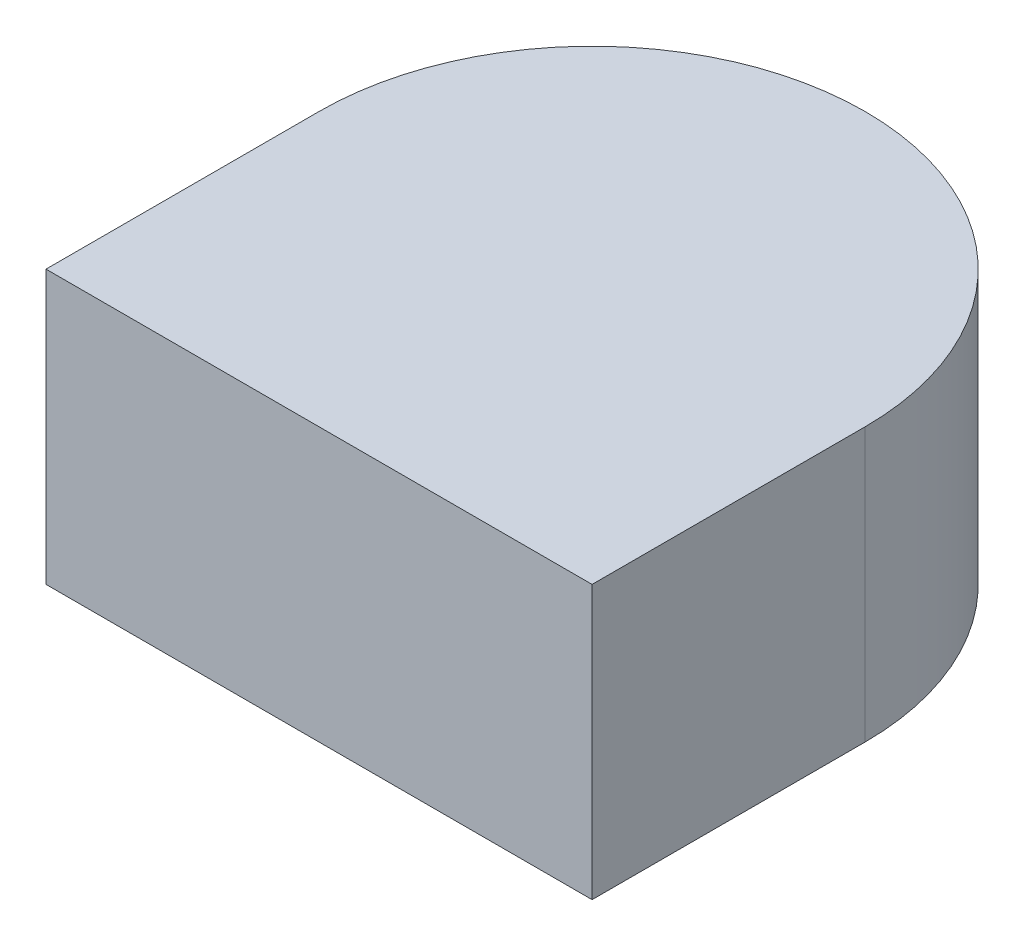
ISO-10303-21;
HEADER;
FILE_DESCRIPTION(('STEP AP214'),'2;1');
FILE_NAME('part.step','',(''),(''),'','','');
FILE_SCHEMA(('AUTOMOTIVE_DESIGN { 1 0 10303 214 1 1 1 1 }'));
ENDSEC;
DATA;
#1=APPLICATION_CONTEXT('core data for automotive mechanical design processes');
#2=APPLICATION_PROTOCOL_DEFINITION('international standard','automotive_design',2000,#1);
#3=PRODUCT_CONTEXT('',#1,'mechanical');
#4=PRODUCT('Part','Part','',(#3));
#5=PRODUCT_RELATED_PRODUCT_CATEGORY('part','',(#4));
#6=PRODUCT_DEFINITION_FORMATION('','',#4);
#7=PRODUCT_DEFINITION_CONTEXT('part definition',#1,'design');
#8=PRODUCT_DEFINITION('design','',#6,#7);
#9=PRODUCT_DEFINITION_SHAPE('','',#8);
#10=(LENGTH_UNIT() NAMED_UNIT(*) SI_UNIT(.MILLI.,.METRE.));
#11=(NAMED_UNIT(*) PLANE_ANGLE_UNIT() SI_UNIT($,.RADIAN.));
#12=(NAMED_UNIT(*) SI_UNIT($,.STERADIAN.) SOLID_ANGLE_UNIT());
#13=UNCERTAINTY_MEASURE_WITH_UNIT(LENGTH_MEASURE(1.E-05),#10,'distance_accuracy_value','');
#14=(GEOMETRIC_REPRESENTATION_CONTEXT(3) GLOBAL_UNCERTAINTY_ASSIGNED_CONTEXT((#13)) GLOBAL_UNIT_ASSIGNED_CONTEXT((#10,
#11,#12)) REPRESENTATION_CONTEXT('',''));
#15=CARTESIAN_POINT('',(0.,0.,0.));
#16=DIRECTION('',(0.,0.,1.));
#17=DIRECTION('',(1.,0.,0.));
#18=AXIS2_PLACEMENT_3D('',#15,#16,#17);
#19=CARTESIAN_POINT('',(-20.,20.,40.));
#20=DIRECTION('',(1.,0.,0.));
#21=DIRECTION('',(0.,0.,-1.));
#22=AXIS2_PLACEMENT_3D('',#19,#20,#21);
#23=PLANE('',#22);
#24=DIRECTION('',(0.,0.,1.));
#25=VECTOR('',#24,1.);
#26=CARTESIAN_POINT('',(-20.,0.,40.));
#27=LINE('',#26,#25);
#28=CARTESIAN_POINT('',(-20.,0.,20.));
#29=VERTEX_POINT('',#28);
#30=CARTESIAN_POINT('',(-20.,0.,40.));
#31=VERTEX_POINT('',#30);
#32=EDGE_CURVE('E100',#29,#31,#27,.T.);
#33=ORIENTED_EDGE('',*,*,#32,.T.);
#34=DIRECTION('',(0.,-1.,0.));
#35=VECTOR('',#34,1.);
#36=CARTESIAN_POINT('',(-20.,20.,40.));
#37=LINE('',#36,#35);
#38=CARTESIAN_POINT('',(-20.,20.,40.));
#39=VERTEX_POINT('',#38);
#40=EDGE_CURVE('E11',#39,#31,#37,.T.);
#41=ORIENTED_EDGE('',*,*,#40,.F.);
#42=DIRECTION('',(0.,0.,1.));
#43=VECTOR('',#42,1.);
#44=CARTESIAN_POINT('',(-20.,20.,40.));
#45=LINE('',#44,#43);
#46=CARTESIAN_POINT('',(-20.,20.,20.));
#47=VERTEX_POINT('',#46);
#48=EDGE_CURVE('E88',#47,#39,#45,.T.);
#49=ORIENTED_EDGE('',*,*,#48,.F.);
#50=DIRECTION('',(0.,-1.,0.));
#51=VECTOR('',#50,1.);
#52=CARTESIAN_POINT('',(-20.,20.,20.));
#53=LINE('',#52,#51);
#54=EDGE_CURVE('E96',#47,#29,#53,.T.);
#55=ORIENTED_EDGE('',*,*,#54,.T.);
#56=EDGE_LOOP('',(#33,#41,#49,#55));
#57=FACE_BOUND('',#56,.T.);
#58=ADVANCED_FACE('F37',(#57),#23,.F.);
#59=CARTESIAN_POINT('',(-20.,20.,40.));
#60=DIRECTION('',(0.,0.,-1.));
#61=DIRECTION('',(-1.,0.,0.));
#62=AXIS2_PLACEMENT_3D('',#59,#60,#61);
#63=PLANE('',#62);
#64=DIRECTION('',(1.,0.,0.));
#65=VECTOR('',#64,1.);
#66=CARTESIAN_POINT('',(-20.,0.,40.));
#67=LINE('',#66,#65);
#68=CARTESIAN_POINT('',(20.,0.,40.));
#69=VERTEX_POINT('',#68);
#70=EDGE_CURVE('E92',#31,#69,#67,.T.);
#71=ORIENTED_EDGE('',*,*,#70,.T.);
#72=DIRECTION('',(0.,-1.,0.));
#73=VECTOR('',#72,1.);
#74=CARTESIAN_POINT('',(20.,20.,40.));
#75=LINE('',#74,#73);
#76=CARTESIAN_POINT('',(20.,20.,40.));
#77=VERTEX_POINT('',#76);
#78=EDGE_CURVE('E45',#77,#69,#75,.T.);
#79=ORIENTED_EDGE('',*,*,#78,.F.);
#80=DIRECTION('',(1.,0.,0.));
#81=VECTOR('',#80,1.);
#82=CARTESIAN_POINT('',(-20.,20.,40.));
#83=LINE('',#82,#81);
#84=EDGE_CURVE('E83',#39,#77,#83,.T.);
#85=ORIENTED_EDGE('',*,*,#84,.F.);
#86=ORIENTED_EDGE('',*,*,#40,.T.);
#87=EDGE_LOOP('',(#71,#79,#85,#86));
#88=FACE_BOUND('',#87,.T.);
#89=ADVANCED_FACE('F91',(#88),#63,.F.);
#90=CARTESIAN_POINT('',(20.,20.,40.));
#91=DIRECTION('',(-1.,0.,0.));
#92=DIRECTION('',(0.,0.,1.));
#93=AXIS2_PLACEMENT_3D('',#90,#91,#92);
#94=PLANE('',#93);
#95=DIRECTION('',(0.,0.,-1.));
#96=VECTOR('',#95,1.);
#97=CARTESIAN_POINT('',(20.,0.,40.));
#98=LINE('',#97,#96);
#99=CARTESIAN_POINT('',(20.,0.,20.));
#100=VERTEX_POINT('',#99);
#101=EDGE_CURVE('E70',#69,#100,#98,.T.);
#102=ORIENTED_EDGE('',*,*,#101,.T.);
#103=DIRECTION('',(0.,-1.,0.));
#104=VECTOR('',#103,1.);
#105=CARTESIAN_POINT('',(20.,20.,20.));
#106=LINE('',#105,#104);
#107=CARTESIAN_POINT('',(20.,20.,20.));
#108=VERTEX_POINT('',#107);
#109=EDGE_CURVE('E93',#108,#100,#106,.T.);
#110=ORIENTED_EDGE('',*,*,#109,.F.);
#111=DIRECTION('',(0.,0.,-1.));
#112=VECTOR('',#111,1.);
#113=CARTESIAN_POINT('',(20.,20.,40.));
#114=LINE('',#113,#112);
#115=EDGE_CURVE('E86',#77,#108,#114,.T.);
#116=ORIENTED_EDGE('',*,*,#115,.F.);
#117=ORIENTED_EDGE('',*,*,#78,.T.);
#118=EDGE_LOOP('',(#102,#110,#116,#117));
#119=FACE_BOUND('',#118,.T.);
#120=ADVANCED_FACE('F94',(#119),#94,.F.);
#121=CARTESIAN_POINT('',(0.,20.,20.));
#122=DIRECTION('',(0.,-1.,0.));
#123=DIRECTION('',(0.,0.,-1.));
#124=AXIS2_PLACEMENT_3D('',#121,#122,#123);
#125=CYLINDRICAL_SURFACE('',#124,20.);
#126=CARTESIAN_POINT('',(0.,0.,20.));
#127=DIRECTION('',(0.,1.,0.));
#128=DIRECTION('',(0.,0.,-1.));
#129=AXIS2_PLACEMENT_3D('',#126,#127,#128);
#130=CIRCLE('',#129,20.);
#131=EDGE_CURVE('E76',#100,#29,#130,.T.);
#132=ORIENTED_EDGE('',*,*,#131,.T.);
#133=ORIENTED_EDGE('',*,*,#54,.F.);
#134=CARTESIAN_POINT('',(0.,20.,20.));
#135=DIRECTION('',(0.,1.,0.));
#136=DIRECTION('',(0.,0.,-1.));
#137=AXIS2_PLACEMENT_3D('',#134,#135,#136);
#138=CIRCLE('',#137,20.);
#139=EDGE_CURVE('E53',#108,#47,#138,.T.);
#140=ORIENTED_EDGE('',*,*,#139,.F.);
#141=ORIENTED_EDGE('',*,*,#109,.T.);
#142=EDGE_LOOP('',(#132,#133,#140,#141));
#143=FACE_BOUND('',#142,.T.);
#144=ADVANCED_FACE('F107',(#143),#125,.T.);
#145=CARTESIAN_POINT('',(0.,20.,20.));
#146=DIRECTION('',(0.,-1.,0.));
#147=DIRECTION('',(0.,0.,-1.));
#148=AXIS2_PLACEMENT_3D('',#145,#146,#147);
#149=PLANE('',#148);
#150=ORIENTED_EDGE('',*,*,#48,.T.);
#151=ORIENTED_EDGE('',*,*,#84,.T.);
#152=ORIENTED_EDGE('',*,*,#115,.T.);
#153=ORIENTED_EDGE('',*,*,#139,.T.);
#154=EDGE_LOOP('',(#150,#151,#152,#153));
#155=FACE_BOUND('',#154,.T.);
#156=ADVANCED_FACE('F84',(#155),#149,.F.);
#157=CARTESIAN_POINT('',(0.,0.,20.));
#158=DIRECTION('',(0.,-1.,0.));
#159=DIRECTION('',(0.,0.,-1.));
#160=AXIS2_PLACEMENT_3D('',#157,#158,#159);
#161=PLANE('',#160);
#162=ORIENTED_EDGE('',*,*,#32,.F.);
#163=ORIENTED_EDGE('',*,*,#131,.F.);
#164=ORIENTED_EDGE('',*,*,#101,.F.);
#165=ORIENTED_EDGE('',*,*,#70,.F.);
#166=EDGE_LOOP('',(#162,#163,#164,#165));
#167=FACE_BOUND('',#166,.T.);
#168=ADVANCED_FACE('F110',(#167),#161,.T.);
#169=CLOSED_SHELL('',(#58,#89,#120,#144,#156,#168));
#170=MANIFOLD_SOLID_BREP('B2',#169);
#171=ADVANCED_BREP_SHAPE_REPRESENTATION('',(#18,#170),#14);
#172=SHAPE_DEFINITION_REPRESENTATION(#9,#171);
ENDSEC;
END-ISO-10303-21;
